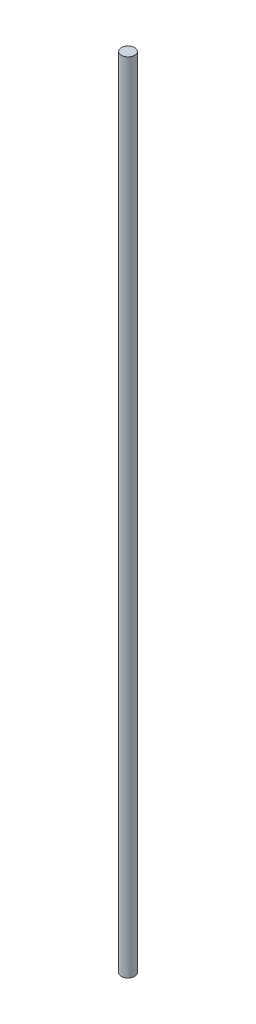
ISO-10303-21;
HEADER;
FILE_DESCRIPTION(('STEP AP214'),'2;1');
FILE_NAME('part.step','',(''),(''),'','','');
FILE_SCHEMA(('AUTOMOTIVE_DESIGN { 1 0 10303 214 1 1 1 1 }'));
ENDSEC;
DATA;
#1=APPLICATION_CONTEXT('core data for automotive mechanical design processes');
#2=APPLICATION_PROTOCOL_DEFINITION('international standard','automotive_design',2000,#1);
#3=PRODUCT_CONTEXT('',#1,'mechanical');
#4=PRODUCT('Part','Part','',(#3));
#5=PRODUCT_RELATED_PRODUCT_CATEGORY('part','',(#4));
#6=PRODUCT_DEFINITION_FORMATION('','',#4);
#7=PRODUCT_DEFINITION_CONTEXT('part definition',#1,'design');
#8=PRODUCT_DEFINITION('design','',#6,#7);
#9=PRODUCT_DEFINITION_SHAPE('','',#8);
#10=(LENGTH_UNIT() NAMED_UNIT(*) SI_UNIT(.MILLI.,.METRE.));
#11=(NAMED_UNIT(*) PLANE_ANGLE_UNIT() SI_UNIT($,.RADIAN.));
#12=(NAMED_UNIT(*) SI_UNIT($,.STERADIAN.) SOLID_ANGLE_UNIT());
#13=UNCERTAINTY_MEASURE_WITH_UNIT(LENGTH_MEASURE(1.E-05),#10,'distance_accuracy_value','');
#14=(GEOMETRIC_REPRESENTATION_CONTEXT(3) GLOBAL_UNCERTAINTY_ASSIGNED_CONTEXT((#13)) GLOBAL_UNIT_ASSIGNED_CONTEXT((#10,
#11,#12)) REPRESENTATION_CONTEXT('',''));
#15=CARTESIAN_POINT('',(0.,0.,0.));
#16=DIRECTION('',(0.,0.,1.));
#17=DIRECTION('',(1.,0.,0.));
#18=AXIS2_PLACEMENT_3D('',#15,#16,#17);
#19=CARTESIAN_POINT('',(1.32839080459768,600.,0.));
#20=DIRECTION('',(0.,-1.,0.));
#21=DIRECTION('',(0.,0.,-1.));
#22=AXIS2_PLACEMENT_3D('',#19,#20,#21);
#23=CYLINDRICAL_SURFACE('',#22,5.);
#24=CARTESIAN_POINT('',(1.32839080459768,600.,0.));
#25=DIRECTION('',(0.,1.,0.));
#26=DIRECTION('',(0.,0.,1.));
#27=AXIS2_PLACEMENT_3D('',#24,#25,#26);
#28=CIRCLE('',#27,5.);
#29=CARTESIAN_POINT('',(1.32839080459768,600.,5.));
#30=VERTEX_POINT('',#29);
#31=EDGE_CURVE('E10',#30,#30,#28,.T.);
#32=ORIENTED_EDGE('',*,*,#31,.F.);
#33=EDGE_LOOP('',(#32));
#34=FACE_BOUND('',#33,.T.);
#35=CARTESIAN_POINT('',(1.32839080459768,0.,0.));
#36=DIRECTION('',(0.,1.,0.));
#37=DIRECTION('',(0.,0.,1.));
#38=AXIS2_PLACEMENT_3D('',#35,#36,#37);
#39=CIRCLE('',#38,5.);
#40=CARTESIAN_POINT('',(1.32839080459768,0.,5.));
#41=VERTEX_POINT('',#40);
#42=EDGE_CURVE('E42',#41,#41,#39,.T.);
#43=ORIENTED_EDGE('',*,*,#42,.T.);
#44=EDGE_LOOP('',(#43));
#45=FACE_BOUND('',#44,.T.);
#46=ADVANCED_FACE('F39',(#34,#45),#23,.T.);
#47=CARTESIAN_POINT('',(1.32839080459768,600.,0.));
#48=DIRECTION('',(0.,1.,0.));
#49=DIRECTION('',(0.,0.,1.));
#50=AXIS2_PLACEMENT_3D('',#47,#48,#49);
#51=PLANE('',#50);
#52=ORIENTED_EDGE('',*,*,#31,.T.);
#53=EDGE_LOOP('',(#52));
#54=FACE_BOUND('',#53,.T.);
#55=ADVANCED_FACE('F54',(#54),#51,.T.);
#56=CARTESIAN_POINT('',(1.32839080459768,0.,0.));
#57=DIRECTION('',(0.,1.,0.));
#58=DIRECTION('',(0.,0.,1.));
#59=AXIS2_PLACEMENT_3D('',#56,#57,#58);
#60=PLANE('',#59);
#61=ORIENTED_EDGE('',*,*,#42,.F.);
#62=EDGE_LOOP('',(#61));
#63=FACE_BOUND('',#62,.T.);
#64=ADVANCED_FACE('F52',(#63),#60,.F.);
#65=CLOSED_SHELL('',(#46,#55,#64));
#66=MANIFOLD_SOLID_BREP('B2',#65);
#67=ADVANCED_BREP_SHAPE_REPRESENTATION('',(#18,#66),#14);
#68=SHAPE_DEFINITION_REPRESENTATION(#9,#67);
ENDSEC;
END-ISO-10303-21;
